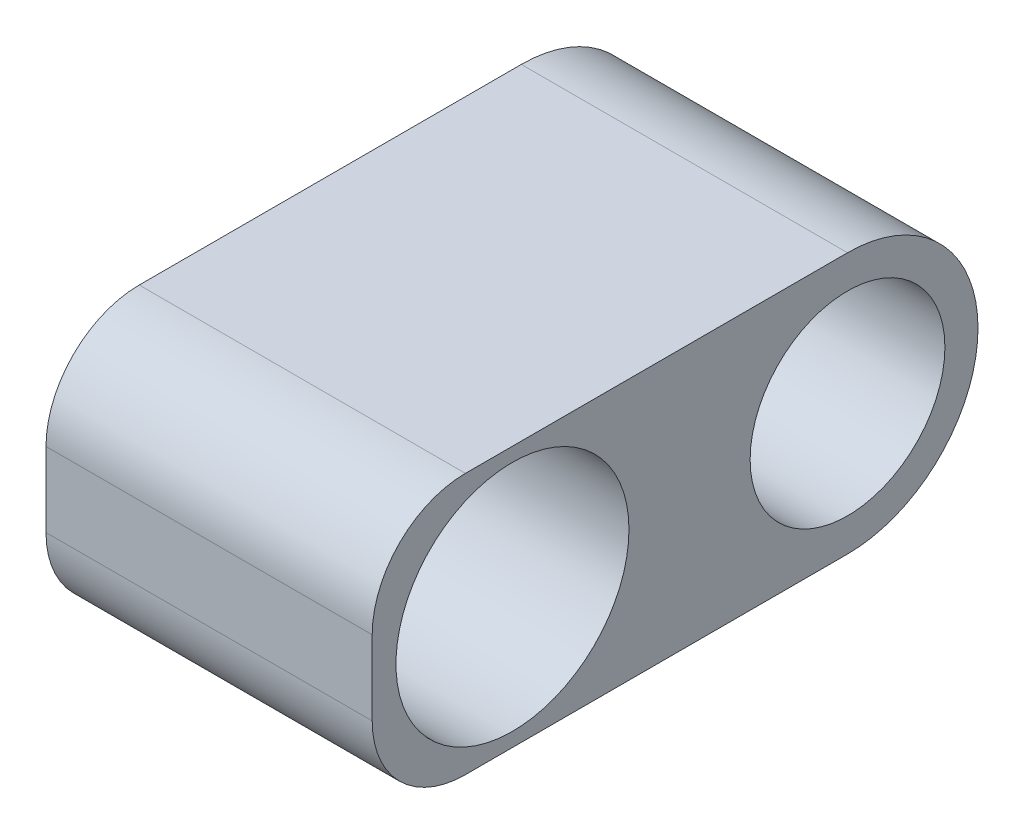
ISO-10303-21;
HEADER;
FILE_DESCRIPTION(('STEP AP214'),'2;1');
FILE_NAME('part.step','',(''),(''),'','','');
FILE_SCHEMA(('AUTOMOTIVE_DESIGN { 1 0 10303 214 1 1 1 1 }'));
ENDSEC;
DATA;
#1=APPLICATION_CONTEXT('core data for automotive mechanical design processes');
#2=APPLICATION_PROTOCOL_DEFINITION('international standard','automotive_design',2000,#1);
#3=PRODUCT_CONTEXT('',#1,'mechanical');
#4=PRODUCT('Part','Part','',(#3));
#5=PRODUCT_RELATED_PRODUCT_CATEGORY('part','',(#4));
#6=PRODUCT_DEFINITION_FORMATION('','',#4);
#7=PRODUCT_DEFINITION_CONTEXT('part definition',#1,'design');
#8=PRODUCT_DEFINITION('design','',#6,#7);
#9=PRODUCT_DEFINITION_SHAPE('','',#8);
#10=(LENGTH_UNIT() NAMED_UNIT(*) SI_UNIT(.MILLI.,.METRE.));
#11=(NAMED_UNIT(*) PLANE_ANGLE_UNIT() SI_UNIT($,.RADIAN.));
#12=(NAMED_UNIT(*) SI_UNIT($,.STERADIAN.) SOLID_ANGLE_UNIT());
#13=UNCERTAINTY_MEASURE_WITH_UNIT(LENGTH_MEASURE(1.E-05),#10,'distance_accuracy_value','');
#14=(GEOMETRIC_REPRESENTATION_CONTEXT(3) GLOBAL_UNCERTAINTY_ASSIGNED_CONTEXT((#13)) GLOBAL_UNIT_ASSIGNED_CONTEXT((#10,
#11,#12)) REPRESENTATION_CONTEXT('',''));
#15=CARTESIAN_POINT('',(0.,0.,0.));
#16=DIRECTION('',(0.,0.,1.));
#17=DIRECTION('',(1.,0.,0.));
#18=AXIS2_PLACEMENT_3D('',#15,#16,#17);
#19=CARTESIAN_POINT('',(-17.,-4.0000000000191,41.0000000000019));
#20=DIRECTION('',(1.,0.,0.));
#21=DIRECTION('',(0.,0.,-1.));
#22=AXIS2_PLACEMENT_3D('',#19,#20,#21);
#23=CYLINDRICAL_SURFACE('',#22,10.);
#24=DIRECTION('',(1.,0.,0.));
#25=VECTOR('',#24,1.);
#26=CARTESIAN_POINT('',(-17.,-4.0000000000191,51.0000000000019));
#27=LINE('',#26,#25);
#28=CARTESIAN_POINT('',(-17.,-4.0000000000191,51.0000000000019));
#29=VERTEX_POINT('',#28);
#30=CARTESIAN_POINT('',(18.,-4.0000000000191,51.0000000000019));
#31=VERTEX_POINT('',#30);
#32=EDGE_CURVE('E135',#29,#31,#27,.T.);
#33=ORIENTED_EDGE('',*,*,#32,.F.);
#34=CARTESIAN_POINT('',(-17.,-4.0000000000191,41.0000000000019));
#35=DIRECTION('',(-1.,0.,0.));
#36=DIRECTION('',(0.,0.,1.));
#37=AXIS2_PLACEMENT_3D('',#34,#35,#36);
#38=CIRCLE('',#37,10.);
#39=CARTESIAN_POINT('',(-17.,-14.00000000001,40.9999999999968));
#40=VERTEX_POINT('',#39);
#41=EDGE_CURVE('E46',#40,#29,#38,.T.);
#42=ORIENTED_EDGE('',*,*,#41,.F.);
#43=DIRECTION('',(1.,0.,0.));
#44=VECTOR('',#43,1.);
#45=CARTESIAN_POINT('',(-17.,-14.00000000001,40.9999999999968));
#46=LINE('',#45,#44);
#47=CARTESIAN_POINT('',(18.,-14.00000000001,40.9999999999968));
#48=VERTEX_POINT('',#47);
#49=EDGE_CURVE('E138',#48,#40,#46,.F.);
#50=ORIENTED_EDGE('',*,*,#49,.F.);
#51=CARTESIAN_POINT('',(18.,-4.0000000000191,41.0000000000019));
#52=DIRECTION('',(-1.,0.,0.));
#53=DIRECTION('',(0.,0.,1.));
#54=AXIS2_PLACEMENT_3D('',#51,#52,#53);
#55=CIRCLE('',#54,10.);
#56=EDGE_CURVE('E11',#31,#48,#55,.F.);
#57=ORIENTED_EDGE('',*,*,#56,.F.);
#58=EDGE_LOOP('',(#33,#42,#50,#57));
#59=FACE_BOUND('',#58,.T.);
#60=ADVANCED_FACE('F39',(#59),#23,.T.);
#61=CARTESIAN_POINT('',(-17.,4.0000000000191,41.0000000000019));
#62=DIRECTION('',(-1.,0.,0.));
#63=DIRECTION('',(0.,0.,1.));
#64=AXIS2_PLACEMENT_3D('',#61,#62,#63);
#65=CYLINDRICAL_SURFACE('',#64,10.);
#66=DIRECTION('',(-1.,0.,0.));
#67=VECTOR('',#66,1.);
#68=CARTESIAN_POINT('',(-17.,4.0000000000191,51.0000000000019));
#69=LINE('',#68,#67);
#70=CARTESIAN_POINT('',(18.,4.0000000000191,51.0000000000019));
#71=VERTEX_POINT('',#70);
#72=CARTESIAN_POINT('',(-17.,4.0000000000191,51.0000000000019));
#73=VERTEX_POINT('',#72);
#74=EDGE_CURVE('E124',#71,#73,#69,.T.);
#75=ORIENTED_EDGE('',*,*,#74,.F.);
#76=CARTESIAN_POINT('',(18.,4.0000000000191,41.0000000000019));
#77=DIRECTION('',(-1.,0.,0.));
#78=DIRECTION('',(0.,0.,1.));
#79=AXIS2_PLACEMENT_3D('',#76,#77,#78);
#80=CIRCLE('',#79,10.);
#81=CARTESIAN_POINT('',(18.,14.00000000001,40.9999999999968));
#82=VERTEX_POINT('',#81);
#83=EDGE_CURVE('E131',#82,#71,#80,.F.);
#84=ORIENTED_EDGE('',*,*,#83,.F.);
#85=DIRECTION('',(-1.,0.,0.));
#86=VECTOR('',#85,1.);
#87=CARTESIAN_POINT('',(-17.,14.00000000001,40.9999999999968));
#88=LINE('',#87,#86);
#89=CARTESIAN_POINT('',(-17.,14.00000000001,40.9999999999968));
#90=VERTEX_POINT('',#89);
#91=EDGE_CURVE('E128',#90,#82,#88,.F.);
#92=ORIENTED_EDGE('',*,*,#91,.F.);
#93=CARTESIAN_POINT('',(-17.,4.0000000000191,41.0000000000019));
#94=DIRECTION('',(-1.,0.,0.));
#95=DIRECTION('',(0.,0.,1.));
#96=AXIS2_PLACEMENT_3D('',#93,#94,#95);
#97=CIRCLE('',#96,10.);
#98=EDGE_CURVE('E133',#73,#90,#97,.T.);
#99=ORIENTED_EDGE('',*,*,#98,.F.);
#100=EDGE_LOOP('',(#75,#84,#92,#99));
#101=FACE_BOUND('',#100,.T.);
#102=ADVANCED_FACE('F147',(#101),#65,.T.);
#103=CARTESIAN_POINT('',(-17.,-14.00000000001,116758.401593134));
#104=DIRECTION('',(0.,-1.,0.));
#105=DIRECTION('',(0.,0.,-1.));
#106=AXIS2_PLACEMENT_3D('',#103,#104,#105);
#107=PLANE('',#106);
#108=DIRECTION('',(0.,0.,-1.));
#109=VECTOR('',#108,1.);
#110=CARTESIAN_POINT('',(18.,-14.00000000001,116758.401593134));
#111=LINE('',#110,#109);
#112=CARTESIAN_POINT('',(18.,-14.,0.));
#113=VERTEX_POINT('',#112);
#114=EDGE_CURVE('E87',#48,#113,#111,.T.);
#115=ORIENTED_EDGE('',*,*,#114,.F.);
#116=ORIENTED_EDGE('',*,*,#49,.T.);
#117=DIRECTION('',(0.,0.,-1.));
#118=VECTOR('',#117,1.);
#119=CARTESIAN_POINT('',(-17.,-14.00000000001,116758.401593134));
#120=LINE('',#119,#118);
#121=CARTESIAN_POINT('',(-17.,-14.,0.));
#122=VERTEX_POINT('',#121);
#123=EDGE_CURVE('E100',#40,#122,#120,.T.);
#124=ORIENTED_EDGE('',*,*,#123,.T.);
#125=DIRECTION('',(1.,0.,0.));
#126=VECTOR('',#125,1.);
#127=CARTESIAN_POINT('',(-17.,-14.,0.));
#128=LINE('',#127,#126);
#129=EDGE_CURVE('E97',#122,#113,#128,.T.);
#130=ORIENTED_EDGE('',*,*,#129,.T.);
#131=EDGE_LOOP('',(#115,#116,#124,#130));
#132=FACE_BOUND('',#131,.T.);
#133=ADVANCED_FACE('F98',(#132),#107,.T.);
#134=CARTESIAN_POINT('',(-17.,-481034.717744328,51.0000000000019));
#135=DIRECTION('',(0.,0.,1.));
#136=DIRECTION('',(1.,0.,0.));
#137=AXIS2_PLACEMENT_3D('',#134,#135,#136);
#138=PLANE('',#137);
#139=DIRECTION('',(0.,-1.,0.));
#140=VECTOR('',#139,1.);
#141=CARTESIAN_POINT('',(-17.,-481034.717744328,51.0000000000019));
#142=LINE('',#141,#140);
#143=EDGE_CURVE('E105',#73,#29,#142,.T.);
#144=ORIENTED_EDGE('',*,*,#143,.T.);
#145=ORIENTED_EDGE('',*,*,#32,.T.);
#146=DIRECTION('',(0.,-1.,0.));
#147=VECTOR('',#146,1.);
#148=CARTESIAN_POINT('',(18.,-481034.717744328,51.0000000000019));
#149=LINE('',#148,#147);
#150=EDGE_CURVE('E111',#71,#31,#149,.T.);
#151=ORIENTED_EDGE('',*,*,#150,.F.);
#152=ORIENTED_EDGE('',*,*,#74,.T.);
#153=EDGE_LOOP('',(#144,#145,#151,#152));
#154=FACE_BOUND('',#153,.T.);
#155=ADVANCED_FACE('F144',(#154),#138,.T.);
#156=CARTESIAN_POINT('',(-17.,14.00000000001,116758.401593134));
#157=DIRECTION('',(0.,1.,0.));
#158=DIRECTION('',(0.,0.,1.));
#159=AXIS2_PLACEMENT_3D('',#156,#157,#158);
#160=PLANE('',#159);
#161=DIRECTION('',(0.,0.,1.));
#162=VECTOR('',#161,1.);
#163=CARTESIAN_POINT('',(-17.,14.00000000001,116758.401593134));
#164=LINE('',#163,#162);
#165=CARTESIAN_POINT('',(-17.,14.00000000001,0.));
#166=VERTEX_POINT('',#165);
#167=EDGE_CURVE('E119',#166,#90,#164,.T.);
#168=ORIENTED_EDGE('',*,*,#167,.T.);
#169=ORIENTED_EDGE('',*,*,#91,.T.);
#170=DIRECTION('',(0.,0.,1.));
#171=VECTOR('',#170,1.);
#172=CARTESIAN_POINT('',(18.,14.00000000001,116758.401593134));
#173=LINE('',#172,#171);
#174=CARTESIAN_POINT('',(18.,14.00000000001,0.));
#175=VERTEX_POINT('',#174);
#176=EDGE_CURVE('E109',#175,#82,#173,.T.);
#177=ORIENTED_EDGE('',*,*,#176,.F.);
#178=DIRECTION('',(1.,0.,0.));
#179=VECTOR('',#178,1.);
#180=CARTESIAN_POINT('',(-17.,14.00000000001,0.));
#181=LINE('',#180,#179);
#182=EDGE_CURVE('E104',#166,#175,#181,.T.);
#183=ORIENTED_EDGE('',*,*,#182,.F.);
#184=EDGE_LOOP('',(#168,#169,#177,#183));
#185=FACE_BOUND('',#184,.T.);
#186=ADVANCED_FACE('F151',(#185),#160,.T.);
#187=CARTESIAN_POINT('',(-17.,0.,0.));
#188=DIRECTION('',(1.,0.,0.));
#189=DIRECTION('',(0.,0.,-1.));
#190=AXIS2_PLACEMENT_3D('',#187,#188,#189);
#191=CYLINDRICAL_SURFACE('',#190,14.);
#192=ORIENTED_EDGE('',*,*,#182,.T.);
#193=CARTESIAN_POINT('',(18.,0.,0.));
#194=DIRECTION('',(-1.,0.,0.));
#195=DIRECTION('',(0.,0.,1.));
#196=AXIS2_PLACEMENT_3D('',#193,#194,#195);
#197=CIRCLE('',#196,14.);
#198=EDGE_CURVE('E92',#175,#113,#197,.T.);
#199=ORIENTED_EDGE('',*,*,#198,.T.);
#200=ORIENTED_EDGE('',*,*,#129,.F.);
#201=CARTESIAN_POINT('',(-17.,0.,0.));
#202=DIRECTION('',(-1.,0.,0.));
#203=DIRECTION('',(0.,0.,1.));
#204=AXIS2_PLACEMENT_3D('',#201,#202,#203);
#205=CIRCLE('',#204,14.);
#206=EDGE_CURVE('E117',#166,#122,#205,.T.);
#207=ORIENTED_EDGE('',*,*,#206,.F.);
#208=EDGE_LOOP('',(#192,#199,#200,#207));
#209=FACE_BOUND('',#208,.T.);
#210=ADVANCED_FACE('F107',(#209),#191,.T.);
#211=CARTESIAN_POINT('',(-17.,0.,0.));
#212=DIRECTION('',(-1.,0.,0.));
#213=DIRECTION('',(0.,0.,1.));
#214=AXIS2_PLACEMENT_3D('',#211,#212,#213);
#215=PLANE('',#214);
#216=CARTESIAN_POINT('',(-17.,0.,35.95));
#217=DIRECTION('',(1.,0.,0.));
#218=DIRECTION('',(0.,0.,-1.));
#219=AXIS2_PLACEMENT_3D('',#216,#217,#218);
#220=CIRCLE('',#219,12.5);
#221=CARTESIAN_POINT('',(-17.,0.,23.45));
#222=VERTEX_POINT('',#221);
#223=EDGE_CURVE('E247',#222,#222,#220,.T.);
#224=ORIENTED_EDGE('',*,*,#223,.T.);
#225=EDGE_LOOP('',(#224));
#226=FACE_BOUND('',#225,.T.);
#227=CARTESIAN_POINT('',(-17.,0.,0.));
#228=DIRECTION('',(1.,0.,0.));
#229=DIRECTION('',(0.,0.,-1.));
#230=AXIS2_PLACEMENT_3D('',#227,#228,#229);
#231=CIRCLE('',#230,6.5);
#232=CARTESIAN_POINT('',(-17.,0.,-6.5));
#233=VERTEX_POINT('',#232);
#234=EDGE_CURVE('E255',#233,#233,#231,.T.);
#235=ORIENTED_EDGE('',*,*,#234,.T.);
#236=EDGE_LOOP('',(#235));
#237=FACE_BOUND('',#236,.T.);
#238=ORIENTED_EDGE('',*,*,#123,.F.);
#239=ORIENTED_EDGE('',*,*,#41,.T.);
#240=ORIENTED_EDGE('',*,*,#143,.F.);
#241=ORIENTED_EDGE('',*,*,#98,.T.);
#242=ORIENTED_EDGE('',*,*,#167,.F.);
#243=ORIENTED_EDGE('',*,*,#206,.T.);
#244=EDGE_LOOP('',(#238,#239,#240,#241,#242,#243));
#245=FACE_BOUND('',#244,.T.);
#246=ADVANCED_FACE('F141',(#226,#237,#245),#215,.T.);
#247=CARTESIAN_POINT('',(18.,0.,0.));
#248=DIRECTION('',(-1.,0.,0.));
#249=DIRECTION('',(0.,0.,1.));
#250=AXIS2_PLACEMENT_3D('',#247,#248,#249);
#251=PLANE('',#250);
#252=CARTESIAN_POINT('',(18.,0.,35.95));
#253=DIRECTION('',(1.,0.,0.));
#254=DIRECTION('',(0.,0.,-1.));
#255=AXIS2_PLACEMENT_3D('',#252,#253,#254);
#256=CIRCLE('',#255,12.5);
#257=CARTESIAN_POINT('',(18.,0.,23.45));
#258=VERTEX_POINT('',#257);
#259=EDGE_CURVE('E250',#258,#258,#256,.T.);
#260=ORIENTED_EDGE('',*,*,#259,.F.);
#261=EDGE_LOOP('',(#260));
#262=FACE_BOUND('',#261,.T.);
#263=CARTESIAN_POINT('',(18.,0.,0.));
#264=DIRECTION('',(1.,0.,0.));
#265=DIRECTION('',(0.,0.,-1.));
#266=AXIS2_PLACEMENT_3D('',#263,#264,#265);
#267=CIRCLE('',#266,10.45);
#268=CARTESIAN_POINT('',(18.,0.,-10.45));
#269=VERTEX_POINT('',#268);
#270=EDGE_CURVE('E258',#269,#269,#267,.T.);
#271=ORIENTED_EDGE('',*,*,#270,.F.);
#272=EDGE_LOOP('',(#271));
#273=FACE_BOUND('',#272,.T.);
#274=ORIENTED_EDGE('',*,*,#150,.T.);
#275=ORIENTED_EDGE('',*,*,#56,.T.);
#276=ORIENTED_EDGE('',*,*,#114,.T.);
#277=ORIENTED_EDGE('',*,*,#198,.F.);
#278=ORIENTED_EDGE('',*,*,#176,.T.);
#279=ORIENTED_EDGE('',*,*,#83,.T.);
#280=EDGE_LOOP('',(#274,#275,#276,#277,#278,#279));
#281=FACE_BOUND('',#280,.T.);
#282=ADVANCED_FACE('F89',(#262,#273,#281),#251,.F.);
#283=CARTESIAN_POINT('',(-9.00000000000001,0.,0.));
#284=DIRECTION('',(1.,0.,0.));
#285=DIRECTION('',(0.,0.,-1.));
#286=AXIS2_PLACEMENT_3D('',#283,#284,#285);
#287=CYLINDRICAL_SURFACE('',#286,10.45);
#288=CARTESIAN_POINT('',(-9.00000000000001,0.,0.));
#289=DIRECTION('',(1.,0.,0.));
#290=DIRECTION('',(0.,0.,-1.));
#291=AXIS2_PLACEMENT_3D('',#288,#289,#290);
#292=CIRCLE('',#291,10.45);
#293=CARTESIAN_POINT('',(-9.00000000000001,0.,-10.45));
#294=VERTEX_POINT('',#293);
#295=EDGE_CURVE('E94',#294,#294,#292,.T.);
#296=ORIENTED_EDGE('',*,*,#295,.F.);
#297=EDGE_LOOP('',(#296));
#298=FACE_BOUND('',#297,.T.);
#299=ORIENTED_EDGE('',*,*,#270,.T.);
#300=EDGE_LOOP('',(#299));
#301=FACE_BOUND('',#300,.T.);
#302=ADVANCED_FACE('F191',(#298,#301),#287,.F.);
#303=CARTESIAN_POINT('',(-9.00000000000001,0.,0.));
#304=DIRECTION('',(1.,0.,0.));
#305=DIRECTION('',(0.,0.,-1.));
#306=AXIS2_PLACEMENT_3D('',#303,#304,#305);
#307=PLANE('',#306);
#308=CARTESIAN_POINT('',(-9.00000000000001,0.,0.));
#309=DIRECTION('',(1.,0.,0.));
#310=DIRECTION('',(0.,0.,-1.));
#311=AXIS2_PLACEMENT_3D('',#308,#309,#310);
#312=CIRCLE('',#311,6.5);
#313=CARTESIAN_POINT('',(-9.00000000000001,0.,-6.5));
#314=VERTEX_POINT('',#313);
#315=EDGE_CURVE('E252',#314,#314,#312,.T.);
#316=ORIENTED_EDGE('',*,*,#315,.F.);
#317=EDGE_LOOP('',(#316));
#318=FACE_BOUND('',#317,.T.);
#319=ORIENTED_EDGE('',*,*,#295,.T.);
#320=EDGE_LOOP('',(#319));
#321=FACE_BOUND('',#320,.T.);
#322=ADVANCED_FACE('F204',(#318,#321),#307,.T.);
#323=CARTESIAN_POINT('',(-17.,0.,0.));
#324=DIRECTION('',(1.,0.,0.));
#325=DIRECTION('',(0.,0.,-1.));
#326=AXIS2_PLACEMENT_3D('',#323,#324,#325);
#327=CYLINDRICAL_SURFACE('',#326,6.5);
#328=ORIENTED_EDGE('',*,*,#234,.F.);
#329=EDGE_LOOP('',(#328));
#330=FACE_BOUND('',#329,.T.);
#331=ORIENTED_EDGE('',*,*,#315,.T.);
#332=EDGE_LOOP('',(#331));
#333=FACE_BOUND('',#332,.T.);
#334=ADVANCED_FACE('F214',(#330,#333),#327,.F.);
#335=CARTESIAN_POINT('',(-17.,0.,35.95));
#336=DIRECTION('',(1.,0.,0.));
#337=DIRECTION('',(0.,0.,-1.));
#338=AXIS2_PLACEMENT_3D('',#335,#336,#337);
#339=CYLINDRICAL_SURFACE('',#338,12.5);
#340=ORIENTED_EDGE('',*,*,#223,.F.);
#341=EDGE_LOOP('',(#340));
#342=FACE_BOUND('',#341,.T.);
#343=ORIENTED_EDGE('',*,*,#259,.T.);
#344=EDGE_LOOP('',(#343));
#345=FACE_BOUND('',#344,.T.);
#346=ADVANCED_FACE('F224',(#342,#345),#339,.F.);
#347=CLOSED_SHELL('',(#60,#102,#133,#155,#186,#210,#246,#282,#302,#322,#334,#346));
#348=MANIFOLD_SOLID_BREP('B2',#347);
#349=ADVANCED_BREP_SHAPE_REPRESENTATION('',(#18,#348),#14);
#350=SHAPE_DEFINITION_REPRESENTATION(#9,#349);
ENDSEC;
END-ISO-10303-21;
